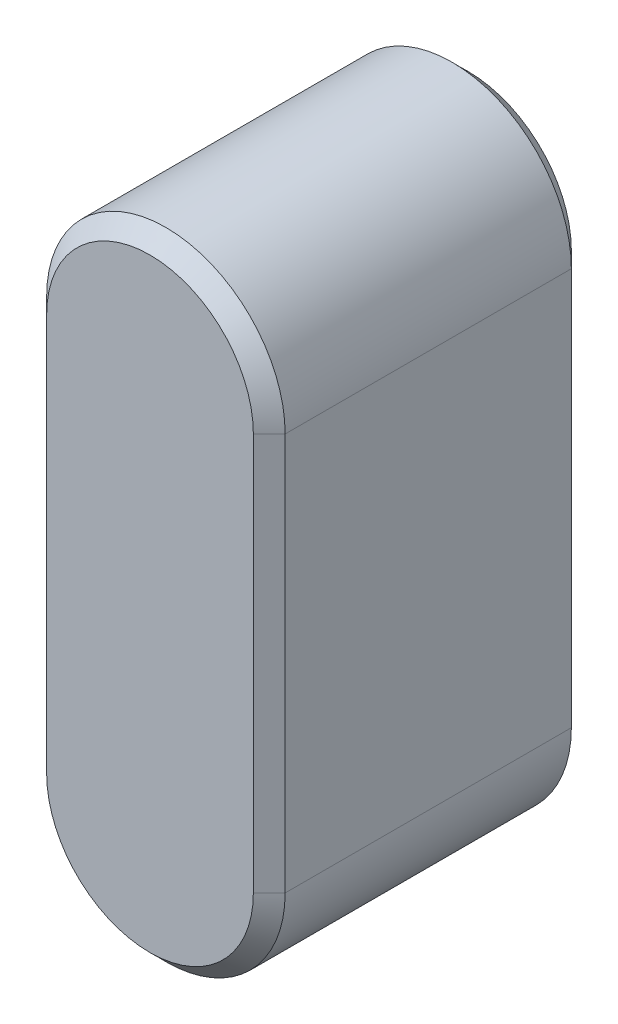
ISO-10303-21;
HEADER;
FILE_DESCRIPTION(('STEP AP214'),'2;1');
FILE_NAME('part.step','',(''),(''),'','','');
FILE_SCHEMA(('AUTOMOTIVE_DESIGN { 1 0 10303 214 1 1 1 1 }'));
ENDSEC;
DATA;
#1=APPLICATION_CONTEXT('core data for automotive mechanical design processes');
#2=APPLICATION_PROTOCOL_DEFINITION('international standard','automotive_design',2000,#1);
#3=PRODUCT_CONTEXT('',#1,'mechanical');
#4=PRODUCT('Part','Part','',(#3));
#5=PRODUCT_RELATED_PRODUCT_CATEGORY('part','',(#4));
#6=PRODUCT_DEFINITION_FORMATION('','',#4);
#7=PRODUCT_DEFINITION_CONTEXT('part definition',#1,'design');
#8=PRODUCT_DEFINITION('design','',#6,#7);
#9=PRODUCT_DEFINITION_SHAPE('','',#8);
#10=(LENGTH_UNIT() NAMED_UNIT(*) SI_UNIT(.MILLI.,.METRE.));
#11=(NAMED_UNIT(*) PLANE_ANGLE_UNIT() SI_UNIT($,.RADIAN.));
#12=(NAMED_UNIT(*) SI_UNIT($,.STERADIAN.) SOLID_ANGLE_UNIT());
#13=UNCERTAINTY_MEASURE_WITH_UNIT(LENGTH_MEASURE(1.E-05),#10,'distance_accuracy_value','');
#14=(GEOMETRIC_REPRESENTATION_CONTEXT(3) GLOBAL_UNCERTAINTY_ASSIGNED_CONTEXT((#13)) GLOBAL_UNIT_ASSIGNED_CONTEXT((#10,
#11,#12)) REPRESENTATION_CONTEXT('',''));
#15=CARTESIAN_POINT('',(0.,0.,0.));
#16=DIRECTION('',(0.,0.,1.));
#17=DIRECTION('',(1.,0.,0.));
#18=AXIS2_PLACEMENT_3D('',#15,#16,#17);
#19=CARTESIAN_POINT('',(0.,-2.5,4.));
#20=DIRECTION('',(0.,0.,-1.));
#21=DIRECTION('',(-1.,0.,0.));
#22=AXIS2_PLACEMENT_3D('',#19,#20,#21);
#23=CYLINDRICAL_SURFACE('',#22,1.5);
#24=DIRECTION('',(0.,0.,-1.));
#25=VECTOR('',#24,1.);
#26=CARTESIAN_POINT('',(-1.5,-2.5,4.));
#27=LINE('',#26,#25);
#28=CARTESIAN_POINT('',(-1.5,-2.5,3.8));
#29=VERTEX_POINT('',#28);
#30=CARTESIAN_POINT('',(-1.5,-2.5,0.200000000000001));
#31=VERTEX_POINT('',#30);
#32=EDGE_CURVE('E110',#29,#31,#27,.T.);
#33=ORIENTED_EDGE('',*,*,#32,.T.);
#34=CARTESIAN_POINT('',(0.,-2.5,0.200000000000001));
#35=DIRECTION('',(0.,0.,1.));
#36=DIRECTION('',(1.,0.,0.));
#37=AXIS2_PLACEMENT_3D('',#34,#35,#36);
#38=CIRCLE('',#37,1.5);
#39=CARTESIAN_POINT('',(1.5,-2.5,0.200000000000001));
#40=VERTEX_POINT('',#39);
#41=EDGE_CURVE('E116',#31,#40,#38,.T.);
#42=ORIENTED_EDGE('',*,*,#41,.T.);
#43=DIRECTION('',(0.,0.,-1.));
#44=VECTOR('',#43,1.);
#45=CARTESIAN_POINT('',(1.5,-2.5,4.));
#46=LINE('',#45,#44);
#47=CARTESIAN_POINT('',(1.5,-2.5,3.8));
#48=VERTEX_POINT('',#47);
#49=EDGE_CURVE('E112',#48,#40,#46,.T.);
#50=ORIENTED_EDGE('',*,*,#49,.F.);
#51=CARTESIAN_POINT('',(0.,-2.5,3.8));
#52=DIRECTION('',(0.,0.,1.));
#53=DIRECTION('',(1.,0.,0.));
#54=AXIS2_PLACEMENT_3D('',#51,#52,#53);
#55=CIRCLE('',#54,1.5);
#56=EDGE_CURVE('E108',#48,#29,#55,.F.);
#57=ORIENTED_EDGE('',*,*,#56,.T.);
#58=EDGE_LOOP('',(#33,#42,#50,#57));
#59=FACE_BOUND('',#58,.T.);
#60=ADVANCED_FACE('F39',(#59),#23,.T.);
#61=CARTESIAN_POINT('',(1.5,-2.5,4.));
#62=DIRECTION('',(-1.,0.,0.));
#63=DIRECTION('',(0.,-1.,0.));
#64=AXIS2_PLACEMENT_3D('',#61,#62,#63);
#65=PLANE('',#64);
#66=ORIENTED_EDGE('',*,*,#49,.T.);
#67=DIRECTION('',(0.,1.,0.));
#68=VECTOR('',#67,1.);
#69=CARTESIAN_POINT('',(1.5,-2.5,0.200000000000001));
#70=LINE('',#69,#68);
#71=CARTESIAN_POINT('',(1.5,2.5,0.200000000000001));
#72=VERTEX_POINT('',#71);
#73=EDGE_CURVE('E174',#40,#72,#70,.T.);
#74=ORIENTED_EDGE('',*,*,#73,.T.);
#75=DIRECTION('',(0.,0.,-1.));
#76=VECTOR('',#75,1.);
#77=CARTESIAN_POINT('',(1.5,2.5,4.));
#78=LINE('',#77,#76);
#79=CARTESIAN_POINT('',(1.5,2.5,3.8));
#80=VERTEX_POINT('',#79);
#81=EDGE_CURVE('E202',#80,#72,#78,.T.);
#82=ORIENTED_EDGE('',*,*,#81,.F.);
#83=DIRECTION('',(0.,-1.,0.));
#84=VECTOR('',#83,1.);
#85=CARTESIAN_POINT('',(1.5,-2.5,3.8));
#86=LINE('',#85,#84);
#87=EDGE_CURVE('E185',#80,#48,#86,.T.);
#88=ORIENTED_EDGE('',*,*,#87,.T.);
#89=EDGE_LOOP('',(#66,#74,#82,#88));
#90=FACE_BOUND('',#89,.T.);
#91=ADVANCED_FACE('F204',(#90),#65,.F.);
#92=CARTESIAN_POINT('',(0.,2.5,4.));
#93=DIRECTION('',(0.,0.,-1.));
#94=DIRECTION('',(-1.,0.,0.));
#95=AXIS2_PLACEMENT_3D('',#92,#93,#94);
#96=CYLINDRICAL_SURFACE('',#95,1.5);
#97=ORIENTED_EDGE('',*,*,#81,.T.);
#98=CARTESIAN_POINT('',(0.,2.5,0.200000000000001));
#99=DIRECTION('',(0.,0.,1.));
#100=DIRECTION('',(1.,0.,0.));
#101=AXIS2_PLACEMENT_3D('',#98,#99,#100);
#102=CIRCLE('',#101,1.5);
#103=CARTESIAN_POINT('',(-1.5,2.5,0.200000000000001));
#104=VERTEX_POINT('',#103);
#105=EDGE_CURVE('E169',#72,#104,#102,.T.);
#106=ORIENTED_EDGE('',*,*,#105,.T.);
#107=DIRECTION('',(0.,0.,-1.));
#108=VECTOR('',#107,1.);
#109=CARTESIAN_POINT('',(-1.5,2.5,4.));
#110=LINE('',#109,#108);
#111=CARTESIAN_POINT('',(-1.5,2.5,3.8));
#112=VERTEX_POINT('',#111);
#113=EDGE_CURVE('E128',#112,#104,#110,.T.);
#114=ORIENTED_EDGE('',*,*,#113,.F.);
#115=CARTESIAN_POINT('',(0.,2.5,3.8));
#116=DIRECTION('',(0.,0.,1.));
#117=DIRECTION('',(1.,0.,0.));
#118=AXIS2_PLACEMENT_3D('',#115,#116,#117);
#119=CIRCLE('',#118,1.5);
#120=EDGE_CURVE('E188',#112,#80,#119,.F.);
#121=ORIENTED_EDGE('',*,*,#120,.T.);
#122=EDGE_LOOP('',(#97,#106,#114,#121));
#123=FACE_BOUND('',#122,.T.);
#124=ADVANCED_FACE('F201',(#123),#96,.T.);
#125=CARTESIAN_POINT('',(-1.5,-2.5,4.));
#126=DIRECTION('',(1.,0.,0.));
#127=DIRECTION('',(0.,1.,0.));
#128=AXIS2_PLACEMENT_3D('',#125,#126,#127);
#129=PLANE('',#128);
#130=ORIENTED_EDGE('',*,*,#113,.T.);
#131=DIRECTION('',(0.,-1.,0.));
#132=VECTOR('',#131,1.);
#133=CARTESIAN_POINT('',(-1.5,-2.5,0.200000000000001));
#134=LINE('',#133,#132);
#135=EDGE_CURVE('E127',#104,#31,#134,.T.);
#136=ORIENTED_EDGE('',*,*,#135,.T.);
#137=ORIENTED_EDGE('',*,*,#32,.F.);
#138=DIRECTION('',(0.,1.,0.));
#139=VECTOR('',#138,1.);
#140=CARTESIAN_POINT('',(-1.5,2.5,3.8));
#141=LINE('',#140,#139);
#142=EDGE_CURVE('E124',#29,#112,#141,.T.);
#143=ORIENTED_EDGE('',*,*,#142,.T.);
#144=EDGE_LOOP('',(#130,#136,#137,#143));
#145=FACE_BOUND('',#144,.T.);
#146=ADVANCED_FACE('F123',(#145),#129,.F.);
#147=CARTESIAN_POINT('',(0.,-2.5,4.));
#148=DIRECTION('',(0.,0.,1.));
#149=DIRECTION('',(1.,0.,0.));
#150=AXIS2_PLACEMENT_3D('',#147,#148,#149);
#151=PLANE('',#150);
#152=CARTESIAN_POINT('',(0.,2.5,4.));
#153=DIRECTION('',(0.,0.,1.));
#154=DIRECTION('',(1.,0.,0.));
#155=AXIS2_PLACEMENT_3D('',#152,#153,#154);
#156=CIRCLE('',#155,1.3);
#157=CARTESIAN_POINT('',(1.3,2.5,4.));
#158=VERTEX_POINT('',#157);
#159=CARTESIAN_POINT('',(-1.3,2.5,4.));
#160=VERTEX_POINT('',#159);
#161=EDGE_CURVE('E191',#158,#160,#156,.T.);
#162=ORIENTED_EDGE('',*,*,#161,.T.);
#163=DIRECTION('',(0.,-1.,0.));
#164=VECTOR('',#163,1.);
#165=CARTESIAN_POINT('',(-1.3,-2.5,4.));
#166=LINE('',#165,#164);
#167=CARTESIAN_POINT('',(-1.3,-2.5,4.));
#168=VERTEX_POINT('',#167);
#169=EDGE_CURVE('E11',#160,#168,#166,.T.);
#170=ORIENTED_EDGE('',*,*,#169,.T.);
#171=CARTESIAN_POINT('',(0.,-2.5,4.));
#172=DIRECTION('',(0.,0.,1.));
#173=DIRECTION('',(1.,0.,0.));
#174=AXIS2_PLACEMENT_3D('',#171,#172,#173);
#175=CIRCLE('',#174,1.3);
#176=CARTESIAN_POINT('',(1.3,-2.5,4.));
#177=VERTEX_POINT('',#176);
#178=EDGE_CURVE('E49',#168,#177,#175,.T.);
#179=ORIENTED_EDGE('',*,*,#178,.T.);
#180=DIRECTION('',(0.,1.,0.));
#181=VECTOR('',#180,1.);
#182=CARTESIAN_POINT('',(1.3,2.5,4.));
#183=LINE('',#182,#181);
#184=EDGE_CURVE('E193',#177,#158,#183,.T.);
#185=ORIENTED_EDGE('',*,*,#184,.T.);
#186=EDGE_LOOP('',(#162,#170,#179,#185));
#187=FACE_BOUND('',#186,.T.);
#188=ADVANCED_FACE('F194',(#187),#151,.T.);
#189=CARTESIAN_POINT('',(0.,-2.5,0.));
#190=DIRECTION('',(0.,0.,1.));
#191=DIRECTION('',(1.,0.,0.));
#192=AXIS2_PLACEMENT_3D('',#189,#190,#191);
#193=PLANE('',#192);
#194=CARTESIAN_POINT('',(0.,-2.5,0.));
#195=DIRECTION('',(0.,0.,1.));
#196=DIRECTION('',(1.,0.,0.));
#197=AXIS2_PLACEMENT_3D('',#194,#195,#196);
#198=CIRCLE('',#197,1.3);
#199=CARTESIAN_POINT('',(1.3,-2.5,0.));
#200=VERTEX_POINT('',#199);
#201=CARTESIAN_POINT('',(-1.3,-2.5,0.));
#202=VERTEX_POINT('',#201);
#203=EDGE_CURVE('E177',#200,#202,#198,.F.);
#204=ORIENTED_EDGE('',*,*,#203,.T.);
#205=DIRECTION('',(0.,1.,0.));
#206=VECTOR('',#205,1.);
#207=CARTESIAN_POINT('',(-1.3,-2.5,0.));
#208=LINE('',#207,#206);
#209=CARTESIAN_POINT('',(-1.3,2.5,0.));
#210=VERTEX_POINT('',#209);
#211=EDGE_CURVE('E117',#202,#210,#208,.T.);
#212=ORIENTED_EDGE('',*,*,#211,.T.);
#213=CARTESIAN_POINT('',(0.,2.5,0.));
#214=DIRECTION('',(0.,0.,1.));
#215=DIRECTION('',(1.,0.,0.));
#216=AXIS2_PLACEMENT_3D('',#213,#214,#215);
#217=CIRCLE('',#216,1.3);
#218=CARTESIAN_POINT('',(1.3,2.5,0.));
#219=VERTEX_POINT('',#218);
#220=EDGE_CURVE('E167',#210,#219,#217,.F.);
#221=ORIENTED_EDGE('',*,*,#220,.T.);
#222=DIRECTION('',(0.,-1.,0.));
#223=VECTOR('',#222,1.);
#224=CARTESIAN_POINT('',(1.3,-2.5,0.));
#225=LINE('',#224,#223);
#226=EDGE_CURVE('E175',#219,#200,#225,.T.);
#227=ORIENTED_EDGE('',*,*,#226,.T.);
#228=EDGE_LOOP('',(#204,#212,#221,#227));
#229=FACE_BOUND('',#228,.T.);
#230=ADVANCED_FACE('F229',(#229),#193,.F.);
#231=CARTESIAN_POINT('',(1.5,-2.5,0.200000000000001));
#232=DIRECTION('',(-0.707106781186547,0.,0.707106781186548));
#233=DIRECTION('',(0.,1.,0.));
#234=AXIS2_PLACEMENT_3D('',#231,#232,#233);
#235=PLANE('',#234);
#236=DIRECTION('',(0.707106781186548,0.,0.707106781186547));
#237=VECTOR('',#236,1.);
#238=CARTESIAN_POINT('',(1.3,-2.5,0.));
#239=LINE('',#238,#237);
#240=EDGE_CURVE('E153',#200,#40,#239,.T.);
#241=ORIENTED_EDGE('',*,*,#240,.F.);
#242=ORIENTED_EDGE('',*,*,#226,.F.);
#243=DIRECTION('',(-0.707106781186548,0.,-0.707106781186547));
#244=VECTOR('',#243,1.);
#245=CARTESIAN_POINT('',(1.5,2.5,0.200000000000001));
#246=LINE('',#245,#244);
#247=EDGE_CURVE('E129',#72,#219,#246,.T.);
#248=ORIENTED_EDGE('',*,*,#247,.F.);
#249=ORIENTED_EDGE('',*,*,#73,.F.);
#250=EDGE_LOOP('',(#241,#242,#248,#249));
#251=FACE_BOUND('',#250,.T.);
#252=ADVANCED_FACE('F173',(#251),#235,.F.);
#253=CARTESIAN_POINT('',(0.,2.5,0.200000000000001));
#254=DIRECTION('',(0.,0.,1.));
#255=DIRECTION('',(1.,0.,0.));
#256=AXIS2_PLACEMENT_3D('',#253,#254,#255);
#257=CONICAL_SURFACE('',#256,1.5,0.785398163397449);
#258=ORIENTED_EDGE('',*,*,#247,.T.);
#259=ORIENTED_EDGE('',*,*,#220,.F.);
#260=DIRECTION('',(0.707106781186548,0.,-0.707106781186547));
#261=VECTOR('',#260,1.);
#262=CARTESIAN_POINT('',(-1.5,2.5,0.200000000000001));
#263=LINE('',#262,#261);
#264=EDGE_CURVE('E147',#104,#210,#263,.T.);
#265=ORIENTED_EDGE('',*,*,#264,.F.);
#266=ORIENTED_EDGE('',*,*,#105,.F.);
#267=EDGE_LOOP('',(#258,#259,#265,#266));
#268=FACE_BOUND('',#267,.T.);
#269=ADVANCED_FACE('F165',(#268),#257,.T.);
#270=CARTESIAN_POINT('',(0.,-2.5,0.200000000000001));
#271=DIRECTION('',(0.,0.,1.));
#272=DIRECTION('',(1.,0.,0.));
#273=AXIS2_PLACEMENT_3D('',#270,#271,#272);
#274=CONICAL_SURFACE('',#273,1.5,0.785398163397449);
#275=ORIENTED_EDGE('',*,*,#240,.T.);
#276=ORIENTED_EDGE('',*,*,#41,.F.);
#277=DIRECTION('',(-0.707106781186548,0.,0.707106781186547));
#278=VECTOR('',#277,1.);
#279=CARTESIAN_POINT('',(-1.3,-2.5,0.));
#280=LINE('',#279,#278);
#281=EDGE_CURVE('E143',#202,#31,#280,.T.);
#282=ORIENTED_EDGE('',*,*,#281,.F.);
#283=ORIENTED_EDGE('',*,*,#203,.F.);
#284=EDGE_LOOP('',(#275,#276,#282,#283));
#285=FACE_BOUND('',#284,.T.);
#286=ADVANCED_FACE('F210',(#285),#274,.T.);
#287=CARTESIAN_POINT('',(-1.5,-2.5,0.200000000000001));
#288=DIRECTION('',(0.707106781186547,0.,0.707106781186548));
#289=DIRECTION('',(0.,-1.,0.));
#290=AXIS2_PLACEMENT_3D('',#287,#288,#289);
#291=PLANE('',#290);
#292=ORIENTED_EDGE('',*,*,#264,.T.);
#293=ORIENTED_EDGE('',*,*,#211,.F.);
#294=ORIENTED_EDGE('',*,*,#281,.T.);
#295=ORIENTED_EDGE('',*,*,#135,.F.);
#296=EDGE_LOOP('',(#292,#293,#294,#295));
#297=FACE_BOUND('',#296,.T.);
#298=ADVANCED_FACE('F208',(#297),#291,.F.);
#299=CARTESIAN_POINT('',(1.3,-2.5,4.));
#300=DIRECTION('',(0.707106781186551,0.,0.707106781186544));
#301=DIRECTION('',(0.,-1.,0.));
#302=AXIS2_PLACEMENT_3D('',#299,#300,#301);
#303=PLANE('',#302);
#304=DIRECTION('',(-0.707106781186544,0.,0.707106781186551));
#305=VECTOR('',#304,1.);
#306=CARTESIAN_POINT('',(1.5,-2.5,3.8));
#307=LINE('',#306,#305);
#308=EDGE_CURVE('E138',#48,#177,#307,.T.);
#309=ORIENTED_EDGE('',*,*,#308,.F.);
#310=ORIENTED_EDGE('',*,*,#87,.F.);
#311=DIRECTION('',(0.707106781186544,0.,-0.707106781186551));
#312=VECTOR('',#311,1.);
#313=CARTESIAN_POINT('',(1.3,2.5,4.));
#314=LINE('',#313,#312);
#315=EDGE_CURVE('E44',#158,#80,#314,.T.);
#316=ORIENTED_EDGE('',*,*,#315,.F.);
#317=ORIENTED_EDGE('',*,*,#184,.F.);
#318=EDGE_LOOP('',(#309,#310,#316,#317));
#319=FACE_BOUND('',#318,.T.);
#320=ADVANCED_FACE('F42',(#319),#303,.T.);
#321=CARTESIAN_POINT('',(0.,2.5,4.));
#322=DIRECTION('',(0.,0.,-1.));
#323=DIRECTION('',(-1.,0.,0.));
#324=AXIS2_PLACEMENT_3D('',#321,#322,#323);
#325=CONICAL_SURFACE('',#324,1.3,0.785398163397444);
#326=ORIENTED_EDGE('',*,*,#315,.T.);
#327=ORIENTED_EDGE('',*,*,#120,.F.);
#328=DIRECTION('',(-0.707106781186544,0.,-0.707106781186551));
#329=VECTOR('',#328,1.);
#330=CARTESIAN_POINT('',(-1.3,2.5,4.));
#331=LINE('',#330,#329);
#332=EDGE_CURVE('E133',#160,#112,#331,.T.);
#333=ORIENTED_EDGE('',*,*,#332,.F.);
#334=ORIENTED_EDGE('',*,*,#161,.F.);
#335=EDGE_LOOP('',(#326,#327,#333,#334));
#336=FACE_BOUND('',#335,.T.);
#337=ADVANCED_FACE('F197',(#336),#325,.T.);
#338=CARTESIAN_POINT('',(0.,-2.5,4.));
#339=DIRECTION('',(0.,0.,-1.));
#340=DIRECTION('',(-1.,0.,0.));
#341=AXIS2_PLACEMENT_3D('',#338,#339,#340);
#342=CONICAL_SURFACE('',#341,1.3,0.785398163397444);
#343=ORIENTED_EDGE('',*,*,#308,.T.);
#344=ORIENTED_EDGE('',*,*,#178,.F.);
#345=DIRECTION('',(0.707106781186544,0.,0.707106781186551));
#346=VECTOR('',#345,1.);
#347=CARTESIAN_POINT('',(-1.5,-2.5,3.8));
#348=LINE('',#347,#346);
#349=EDGE_CURVE('E57',#29,#168,#348,.T.);
#350=ORIENTED_EDGE('',*,*,#349,.F.);
#351=ORIENTED_EDGE('',*,*,#56,.F.);
#352=EDGE_LOOP('',(#343,#344,#350,#351));
#353=FACE_BOUND('',#352,.T.);
#354=ADVANCED_FACE('F136',(#353),#342,.T.);
#355=CARTESIAN_POINT('',(-1.3,-2.5,4.));
#356=DIRECTION('',(-0.707106781186551,0.,0.707106781186544));
#357=DIRECTION('',(0.,1.,0.));
#358=AXIS2_PLACEMENT_3D('',#355,#356,#357);
#359=PLANE('',#358);
#360=ORIENTED_EDGE('',*,*,#332,.T.);
#361=ORIENTED_EDGE('',*,*,#142,.F.);
#362=ORIENTED_EDGE('',*,*,#349,.T.);
#363=ORIENTED_EDGE('',*,*,#169,.F.);
#364=EDGE_LOOP('',(#360,#361,#362,#363));
#365=FACE_BOUND('',#364,.T.);
#366=ADVANCED_FACE('F131',(#365),#359,.T.);
#367=CLOSED_SHELL('',(#60,#91,#124,#146,#188,#230,#252,#269,#286,#298,#320,#337,#354,#366));
#368=MANIFOLD_SOLID_BREP('B2',#367);
#369=ADVANCED_BREP_SHAPE_REPRESENTATION('',(#18,#368),#14);
#370=SHAPE_DEFINITION_REPRESENTATION(#9,#369);
ENDSEC;
END-ISO-10303-21;
